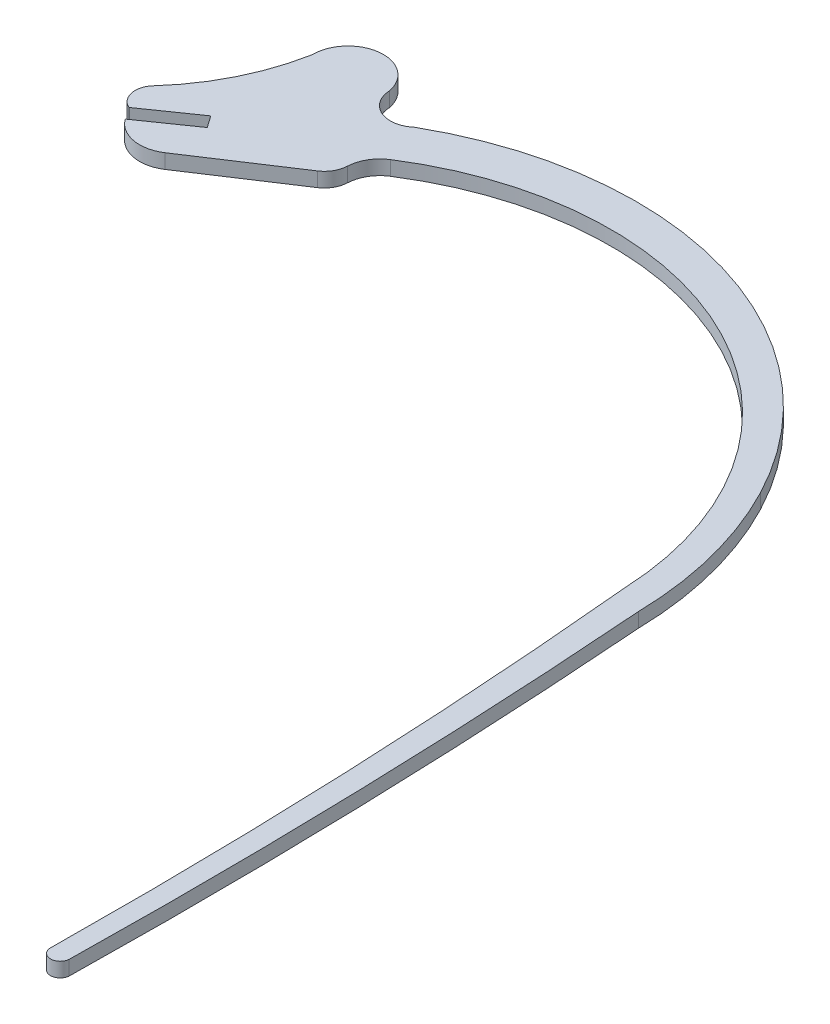
ISO-10303-21;
HEADER;
FILE_DESCRIPTION(('STEP AP214'),'2;1');
FILE_NAME('part.step','',(''),(''),'','','');
FILE_SCHEMA(('AUTOMOTIVE_DESIGN { 1 0 10303 214 1 1 1 1 }'));
ENDSEC;
DATA;
#1=APPLICATION_CONTEXT('core data for automotive mechanical design processes');
#2=APPLICATION_PROTOCOL_DEFINITION('international standard','automotive_design',2000,#1);
#3=PRODUCT_CONTEXT('',#1,'mechanical');
#4=PRODUCT('Part','Part','',(#3));
#5=PRODUCT_RELATED_PRODUCT_CATEGORY('part','',(#4));
#6=PRODUCT_DEFINITION_FORMATION('','',#4);
#7=PRODUCT_DEFINITION_CONTEXT('part definition',#1,'design');
#8=PRODUCT_DEFINITION('design','',#6,#7);
#9=PRODUCT_DEFINITION_SHAPE('','',#8);
#10=(LENGTH_UNIT() NAMED_UNIT(*) SI_UNIT(.MILLI.,.METRE.));
#11=(NAMED_UNIT(*) PLANE_ANGLE_UNIT() SI_UNIT($,.RADIAN.));
#12=(NAMED_UNIT(*) SI_UNIT($,.STERADIAN.) SOLID_ANGLE_UNIT());
#13=UNCERTAINTY_MEASURE_WITH_UNIT(LENGTH_MEASURE(1.E-05),#10,'distance_accuracy_value','');
#14=(GEOMETRIC_REPRESENTATION_CONTEXT(3) GLOBAL_UNCERTAINTY_ASSIGNED_CONTEXT((#13)) GLOBAL_UNIT_ASSIGNED_CONTEXT((#10,
#11,#12)) REPRESENTATION_CONTEXT('',''));
#15=CARTESIAN_POINT('',(0.,0.,0.));
#16=DIRECTION('',(0.,0.,1.));
#17=DIRECTION('',(1.,0.,0.));
#18=AXIS2_PLACEMENT_3D('',#15,#16,#17);
#19=CARTESIAN_POINT('',(-41890.0776006969,3.,-18429.1678708111));
#20=DIRECTION('',(0.,-1.,0.));
#21=DIRECTION('',(0.,0.,-1.));
#22=AXIS2_PLACEMENT_3D('',#19,#20,#21);
#23=CYLINDRICAL_SURFACE('',#22,7.45792893253138);
#24=CARTESIAN_POINT('',(-41890.0776006969,0.,-18429.1678708111));
#25=DIRECTION('',(0.,1.,0.));
#26=DIRECTION('',(0.,0.,1.));
#27=AXIS2_PLACEMENT_3D('',#24,#25,#26);
#28=CIRCLE('',#27,7.45792893253138);
#29=CARTESIAN_POINT('',(-41896.148437,0.,-18424.835937));
#30=VERTEX_POINT('',#29);
#31=CARTESIAN_POINT('',(-41885.984375,0.,-18422.933594));
#32=VERTEX_POINT('',#31);
#33=EDGE_CURVE('E185',#30,#32,#28,.T.);
#34=ORIENTED_EDGE('',*,*,#33,.T.);
#35=DIRECTION('',(0.,-1.,0.));
#36=VECTOR('',#35,1.);
#37=CARTESIAN_POINT('',(-41885.984375,3.,-18422.933594));
#38=LINE('',#37,#36);
#39=CARTESIAN_POINT('',(-41885.984375,3.,-18422.933594));
#40=VERTEX_POINT('',#39);
#41=EDGE_CURVE('E11',#40,#32,#38,.T.);
#42=ORIENTED_EDGE('',*,*,#41,.F.);
#43=CARTESIAN_POINT('',(-41890.0776006969,3.,-18429.1678708111));
#44=DIRECTION('',(0.,1.,0.));
#45=DIRECTION('',(0.,0.,1.));
#46=AXIS2_PLACEMENT_3D('',#43,#44,#45);
#47=CIRCLE('',#46,7.45792893253138);
#48=CARTESIAN_POINT('',(-41896.148437,3.,-18424.835937));
#49=VERTEX_POINT('',#48);
#50=EDGE_CURVE('E217',#49,#40,#47,.T.);
#51=ORIENTED_EDGE('',*,*,#50,.F.);
#52=DIRECTION('',(0.,-1.,0.));
#53=VECTOR('',#52,1.);
#54=CARTESIAN_POINT('',(-41896.148437,3.,-18424.835937));
#55=LINE('',#54,#53);
#56=EDGE_CURVE('E181',#49,#30,#55,.T.);
#57=ORIENTED_EDGE('',*,*,#56,.T.);
#58=EDGE_LOOP('',(#34,#42,#51,#57));
#59=FACE_BOUND('',#58,.T.);
#60=ADVANCED_FACE('F35',(#59),#23,.T.);
#61=CARTESIAN_POINT('',(-41866.9795919999,3.,-18435.427652));
#62=DIRECTION('',(-0.549337573256336,0.,-0.835600520948162));
#63=DIRECTION('',(-0.835600520948162,0.,0.549337573256336));
#64=AXIS2_PLACEMENT_3D('',#61,#62,#63);
#65=PLANE('',#64);
#66=DIRECTION('',(0.835600520948162,0.,-0.549337573256336));
#67=VECTOR('',#66,1.);
#68=CARTESIAN_POINT('',(-41866.9795919999,0.,-18435.427652));
#69=LINE('',#68,#67);
#70=CARTESIAN_POINT('',(-41866.979592,0.,-18435.427652));
#71=VERTEX_POINT('',#70);
#72=EDGE_CURVE('E188',#32,#71,#69,.T.);
#73=ORIENTED_EDGE('',*,*,#72,.T.);
#74=DIRECTION('',(0.,-1.,0.));
#75=VECTOR('',#74,1.);
#76=CARTESIAN_POINT('',(-41866.979592,3.,-18435.427652));
#77=LINE('',#76,#75);
#78=CARTESIAN_POINT('',(-41866.979592,3.,-18435.427652));
#79=VERTEX_POINT('',#78);
#80=EDGE_CURVE('E43',#79,#71,#77,.T.);
#81=ORIENTED_EDGE('',*,*,#80,.F.);
#82=DIRECTION('',(0.835600520948162,0.,-0.549337573256336));
#83=VECTOR('',#82,1.);
#84=CARTESIAN_POINT('',(-41866.9795919999,3.,-18435.427652));
#85=LINE('',#84,#83);
#86=EDGE_CURVE('E121',#40,#79,#85,.T.);
#87=ORIENTED_EDGE('',*,*,#86,.F.);
#88=ORIENTED_EDGE('',*,*,#41,.T.);
#89=EDGE_LOOP('',(#73,#81,#87,#88));
#90=FACE_BOUND('',#89,.T.);
#91=ADVANCED_FACE('F320',(#90),#65,.F.);
#92=CARTESIAN_POINT('',(-41869.7257293976,3.,-18439.6069290477));
#93=DIRECTION('',(0.,-1.,0.));
#94=DIRECTION('',(0.,0.,-1.));
#95=AXIS2_PLACEMENT_3D('',#92,#93,#94);
#96=CYLINDRICAL_SURFACE('',#95,5.00076266665453);
#97=CARTESIAN_POINT('',(-41869.7257293976,0.,-18439.6069290477));
#98=DIRECTION('',(0.,1.,0.));
#99=DIRECTION('',(0.,0.,1.));
#100=AXIS2_PLACEMENT_3D('',#97,#98,#99);
#101=CIRCLE('',#100,5.00076266665453);
#102=CARTESIAN_POINT('',(-41864.730505,0.,-18439.371641));
#103=VERTEX_POINT('',#102);
#104=EDGE_CURVE('E190',#71,#103,#101,.T.);
#105=ORIENTED_EDGE('',*,*,#104,.T.);
#106=DIRECTION('',(0.,-1.,0.));
#107=VECTOR('',#106,1.);
#108=CARTESIAN_POINT('',(-41864.730505,3.,-18439.371641));
#109=LINE('',#108,#107);
#110=CARTESIAN_POINT('',(-41864.730505,3.,-18439.371641));
#111=VERTEX_POINT('',#110);
#112=EDGE_CURVE('E251',#111,#103,#109,.T.);
#113=ORIENTED_EDGE('',*,*,#112,.F.);
#114=CARTESIAN_POINT('',(-41869.7257293976,3.,-18439.6069290477));
#115=DIRECTION('',(0.,1.,0.));
#116=DIRECTION('',(0.,0.,1.));
#117=AXIS2_PLACEMENT_3D('',#114,#115,#116);
#118=CIRCLE('',#117,5.00076266665453);
#119=EDGE_CURVE('E259',#79,#111,#118,.T.);
#120=ORIENTED_EDGE('',*,*,#119,.F.);
#121=ORIENTED_EDGE('',*,*,#80,.T.);
#122=EDGE_LOOP('',(#105,#113,#120,#121));
#123=FACE_BOUND('',#122,.T.);
#124=ADVANCED_FACE('F257',(#123),#96,.T.);
#125=CARTESIAN_POINT('',(-41857.6633660481,3.,-18439.0441717351));
#126=DIRECTION('',(0.,-1.,0.));
#127=DIRECTION('',(0.,0.,-1.));
#128=AXIS2_PLACEMENT_3D('',#125,#126,#127);
#129=CYLINDRICAL_SURFACE('',#128,7.07472183800304);
#130=CARTESIAN_POINT('',(-41857.6633660481,0.,-18439.0441717351));
#131=DIRECTION('',(0.,-1.,0.));
#132=DIRECTION('',(0.,0.,1.));
#133=AXIS2_PLACEMENT_3D('',#130,#131,#132);
#134=CIRCLE('',#133,7.07472183800304);
#135=CARTESIAN_POINT('',(-41861.4689960001,0.,-18445.008136));
#136=VERTEX_POINT('',#135);
#137=EDGE_CURVE('E192',#103,#136,#134,.T.);
#138=ORIENTED_EDGE('',*,*,#137,.T.);
#139=DIRECTION('',(0.,-1.,0.));
#140=VECTOR('',#139,1.);
#141=CARTESIAN_POINT('',(-41861.4689960001,3.,-18445.008136));
#142=LINE('',#141,#140);
#143=CARTESIAN_POINT('',(-41861.4689960001,3.,-18445.008136));
#144=VERTEX_POINT('',#143);
#145=EDGE_CURVE('E248',#144,#136,#142,.T.);
#146=ORIENTED_EDGE('',*,*,#145,.F.);
#147=CARTESIAN_POINT('',(-41857.6633660481,3.,-18439.0441717351));
#148=DIRECTION('',(0.,-1.,0.));
#149=DIRECTION('',(0.,0.,1.));
#150=AXIS2_PLACEMENT_3D('',#147,#148,#149);
#151=CIRCLE('',#150,7.07472183800304);
#152=EDGE_CURVE('E277',#111,#144,#151,.T.);
#153=ORIENTED_EDGE('',*,*,#152,.F.);
#154=ORIENTED_EDGE('',*,*,#112,.T.);
#155=EDGE_LOOP('',(#138,#146,#153,#154));
#156=FACE_BOUND('',#155,.T.);
#157=ADVANCED_FACE('F268',(#156),#129,.F.);
#158=CARTESIAN_POINT('',(-41826.1250165417,3.,-18389.6015705834));
#159=DIRECTION('',(0.,-1.,0.));
#160=DIRECTION('',(0.,0.,-1.));
#161=AXIS2_PLACEMENT_3D('',#158,#159,#160);
#162=CYLINDRICAL_SURFACE('',#161,65.719741137802);
#163=CARTESIAN_POINT('',(-41826.1250165417,0.,-18389.6015705834));
#164=DIRECTION('',(0.,-1.,0.));
#165=DIRECTION('',(0.,0.,1.));
#166=AXIS2_PLACEMENT_3D('',#163,#164,#165);
#167=CIRCLE('',#166,65.719741137802);
#168=CARTESIAN_POINT('',(-41760.4738210001,0.,-18392.6023870008));
#169=VERTEX_POINT('',#168);
#170=EDGE_CURVE('E194',#136,#169,#167,.T.);
#171=ORIENTED_EDGE('',*,*,#170,.T.);
#172=DIRECTION('',(0.,-1.,0.));
#173=VECTOR('',#172,1.);
#174=CARTESIAN_POINT('',(-41760.4738210001,3.,-18392.6023870008));
#175=LINE('',#174,#173);
#176=CARTESIAN_POINT('',(-41760.4738210001,3.,-18392.6023870008));
#177=VERTEX_POINT('',#176);
#178=EDGE_CURVE('E245',#177,#169,#175,.T.);
#179=ORIENTED_EDGE('',*,*,#178,.F.);
#180=CARTESIAN_POINT('',(-41826.1250165417,3.,-18389.6015705834));
#181=DIRECTION('',(0.,-1.,0.));
#182=DIRECTION('',(0.,0.,1.));
#183=AXIS2_PLACEMENT_3D('',#180,#181,#182);
#184=CIRCLE('',#183,65.719741137802);
#185=EDGE_CURVE('E274',#144,#177,#184,.T.);
#186=ORIENTED_EDGE('',*,*,#185,.F.);
#187=ORIENTED_EDGE('',*,*,#145,.T.);
#188=EDGE_LOOP('',(#171,#179,#186,#187));
#189=FACE_BOUND('',#188,.T.);
#190=ADVANCED_FACE('F272',(#189),#162,.F.);
#191=CARTESIAN_POINT('',(-42916.2538828003,3.,-18282.8705311043));
#192=DIRECTION('',(0.,-1.,0.));
#193=DIRECTION('',(0.,0.,-1.));
#194=AXIS2_PLACEMENT_3D('',#191,#192,#193);
#195=CYLINDRICAL_SURFACE('',#194,1160.977446574);
#196=CARTESIAN_POINT('',(-42916.2538828003,0.,-18282.8705311043));
#197=DIRECTION('',(0.,-1.,0.));
#198=DIRECTION('',(0.,0.,1.));
#199=AXIS2_PLACEMENT_3D('',#196,#197,#198);
#200=CIRCLE('',#199,1160.977446574);
#201=CARTESIAN_POINT('',(-41755.363965,0.,-18268.614648));
#202=VERTEX_POINT('',#201);
#203=EDGE_CURVE('E196',#169,#202,#200,.T.);
#204=ORIENTED_EDGE('',*,*,#203,.T.);
#205=DIRECTION('',(0.,-1.,0.));
#206=VECTOR('',#205,1.);
#207=CARTESIAN_POINT('',(-41755.363965,3.,-18268.614648));
#208=LINE('',#207,#206);
#209=CARTESIAN_POINT('',(-41755.363965,3.,-18268.614648));
#210=VERTEX_POINT('',#209);
#211=EDGE_CURVE('E242',#210,#202,#208,.T.);
#212=ORIENTED_EDGE('',*,*,#211,.F.);
#213=CARTESIAN_POINT('',(-42916.2538828003,3.,-18282.8705311043));
#214=DIRECTION('',(0.,-1.,0.));
#215=DIRECTION('',(0.,0.,1.));
#216=AXIS2_PLACEMENT_3D('',#213,#214,#215);
#217=CIRCLE('',#216,1160.977446574);
#218=EDGE_CURVE('E276',#177,#210,#217,.T.);
#219=ORIENTED_EDGE('',*,*,#218,.F.);
#220=ORIENTED_EDGE('',*,*,#178,.T.);
#221=EDGE_LOOP('',(#204,#212,#219,#220));
#222=FACE_BOUND('',#221,.T.);
#223=ADVANCED_FACE('F333',(#222),#195,.F.);
#224=CARTESIAN_POINT('',(-41753.3663240891,3.,-18268.5898071902));
#225=DIRECTION('',(0.,-1.,0.));
#226=DIRECTION('',(0.,0.,-1.));
#227=AXIS2_PLACEMENT_3D('',#224,#225,#226);
#228=CYLINDRICAL_SURFACE('',#227,1.99779535363044);
#229=CARTESIAN_POINT('',(-41753.3663240891,0.,-18268.5898071902));
#230=DIRECTION('',(0.,1.,0.));
#231=DIRECTION('',(0.,0.,1.));
#232=AXIS2_PLACEMENT_3D('',#229,#230,#231);
#233=CIRCLE('',#232,1.99779535363044);
#234=CARTESIAN_POINT('',(-41751.373825,0.,-18268.444433));
#235=VERTEX_POINT('',#234);
#236=EDGE_CURVE('E198',#202,#235,#233,.T.);
#237=ORIENTED_EDGE('',*,*,#236,.T.);
#238=DIRECTION('',(0.,-1.,0.));
#239=VECTOR('',#238,1.);
#240=CARTESIAN_POINT('',(-41751.373825,3.,-18268.444433));
#241=LINE('',#240,#239);
#242=CARTESIAN_POINT('',(-41751.373825,3.,-18268.444433));
#243=VERTEX_POINT('',#242);
#244=EDGE_CURVE('E239',#243,#235,#241,.T.);
#245=ORIENTED_EDGE('',*,*,#244,.F.);
#246=CARTESIAN_POINT('',(-41753.3663240891,3.,-18268.5898071902));
#247=DIRECTION('',(0.,1.,0.));
#248=DIRECTION('',(0.,0.,1.));
#249=AXIS2_PLACEMENT_3D('',#246,#247,#248);
#250=CIRCLE('',#249,1.99779535363044);
#251=EDGE_CURVE('E279',#210,#243,#250,.T.);
#252=ORIENTED_EDGE('',*,*,#251,.F.);
#253=ORIENTED_EDGE('',*,*,#211,.T.);
#254=EDGE_LOOP('',(#237,#245,#252,#253));
#255=FACE_BOUND('',#254,.T.);
#256=ADVANCED_FACE('F336',(#255),#228,.T.);
#257=CARTESIAN_POINT('',(-43051.2068226224,3.,-18292.3207608733));
#258=DIRECTION('',(0.,-1.,0.));
#259=DIRECTION('',(0.,0.,-1.));
#260=AXIS2_PLACEMENT_3D('',#257,#258,#259);
#261=CYLINDRICAL_SURFACE('',#260,1300.0522684649);
#262=CARTESIAN_POINT('',(-43051.2068226224,0.,-18292.3207608733));
#263=DIRECTION('',(0.,1.,0.));
#264=DIRECTION('',(0.,0.,1.));
#265=AXIS2_PLACEMENT_3D('',#262,#263,#264);
#266=CIRCLE('',#265,1300.0522684649);
#267=CARTESIAN_POINT('',(-41754.803806,0.,-18389.6609850006));
#268=VERTEX_POINT('',#267);
#269=EDGE_CURVE('E200',#235,#268,#266,.T.);
#270=ORIENTED_EDGE('',*,*,#269,.T.);
#271=DIRECTION('',(0.,-1.,0.));
#272=VECTOR('',#271,1.);
#273=CARTESIAN_POINT('',(-41754.803806,3.,-18389.6609850006));
#274=LINE('',#273,#272);
#275=CARTESIAN_POINT('',(-41754.803806,3.,-18389.6609850006));
#276=VERTEX_POINT('',#275);
#277=EDGE_CURVE('E236',#276,#268,#274,.T.);
#278=ORIENTED_EDGE('',*,*,#277,.F.);
#279=CARTESIAN_POINT('',(-43051.2068226224,3.,-18292.3207608733));
#280=DIRECTION('',(0.,1.,0.));
#281=DIRECTION('',(0.,0.,1.));
#282=AXIS2_PLACEMENT_3D('',#279,#280,#281);
#283=CIRCLE('',#282,1300.0522684649);
#284=EDGE_CURVE('E285',#243,#276,#283,.T.);
#285=ORIENTED_EDGE('',*,*,#284,.F.);
#286=ORIENTED_EDGE('',*,*,#244,.T.);
#287=EDGE_LOOP('',(#270,#278,#285,#286));
#288=FACE_BOUND('',#287,.T.);
#289=ADVANCED_FACE('F340',(#288),#261,.T.);
#290=CARTESIAN_POINT('',(-41831.1839195737,3.,-18388.2297942268));
#291=DIRECTION('',(0.,-1.,0.));
#292=DIRECTION('',(0.,0.,-1.));
#293=AXIS2_PLACEMENT_3D('',#290,#291,#292);
#294=CYLINDRICAL_SURFACE('',#293,76.3935210377964);
#295=CARTESIAN_POINT('',(-41831.1839195737,0.,-18388.2297942268));
#296=DIRECTION('',(0.,1.,0.));
#297=DIRECTION('',(0.,0.,1.));
#298=AXIS2_PLACEMENT_3D('',#295,#296,#297);
#299=CIRCLE('',#298,76.3935210377964);
#300=CARTESIAN_POINT('',(-41763.425823,0.,-18423.511665));
#301=VERTEX_POINT('',#300);
#302=EDGE_CURVE('E202',#268,#301,#299,.T.);
#303=ORIENTED_EDGE('',*,*,#302,.T.);
#304=DIRECTION('',(0.,-1.,0.));
#305=VECTOR('',#304,1.);
#306=CARTESIAN_POINT('',(-41763.425823,3.,-18423.511665));
#307=LINE('',#306,#305);
#308=CARTESIAN_POINT('',(-41763.425823,3.,-18423.511665));
#309=VERTEX_POINT('',#308);
#310=EDGE_CURVE('E233',#309,#301,#307,.T.);
#311=ORIENTED_EDGE('',*,*,#310,.F.);
#312=CARTESIAN_POINT('',(-41831.1839195737,3.,-18388.2297942268));
#313=DIRECTION('',(0.,1.,0.));
#314=DIRECTION('',(0.,0.,1.));
#315=AXIS2_PLACEMENT_3D('',#312,#313,#314);
#316=CIRCLE('',#315,76.3935210377964);
#317=EDGE_CURVE('E287',#276,#309,#316,.T.);
#318=ORIENTED_EDGE('',*,*,#317,.F.);
#319=ORIENTED_EDGE('',*,*,#277,.T.);
#320=EDGE_LOOP('',(#303,#311,#318,#319));
#321=FACE_BOUND('',#320,.T.);
#322=ADVANCED_FACE('F344',(#321),#294,.T.);
#323=CARTESIAN_POINT('',(-41828.4170991657,3.,-18389.6696663583));
#324=DIRECTION('',(0.,-1.,0.));
#325=DIRECTION('',(0.,0.,-1.));
#326=AXIS2_PLACEMENT_3D('',#323,#324,#325);
#327=CYLINDRICAL_SURFACE('',#326,73.2744624661577);
#328=CARTESIAN_POINT('',(-41828.4170991657,0.,-18389.6696663583));
#329=DIRECTION('',(0.,1.,0.));
#330=DIRECTION('',(0.,0.,1.));
#331=AXIS2_PLACEMENT_3D('',#328,#329,#330);
#332=CIRCLE('',#331,73.2744624661577);
#333=CARTESIAN_POINT('',(-41864.763185,0.,-18453.294417));
#334=VERTEX_POINT('',#333);
#335=EDGE_CURVE('E204',#301,#334,#332,.T.);
#336=ORIENTED_EDGE('',*,*,#335,.T.);
#337=DIRECTION('',(0.,-1.,0.));
#338=VECTOR('',#337,1.);
#339=CARTESIAN_POINT('',(-41864.763185,3.,-18453.294417));
#340=LINE('',#339,#338);
#341=CARTESIAN_POINT('',(-41864.763185,3.,-18453.294417));
#342=VERTEX_POINT('',#341);
#343=EDGE_CURVE('E230',#342,#334,#340,.T.);
#344=ORIENTED_EDGE('',*,*,#343,.F.);
#345=CARTESIAN_POINT('',(-41828.4170991657,3.,-18389.6696663583));
#346=DIRECTION('',(0.,1.,0.));
#347=DIRECTION('',(0.,0.,1.));
#348=AXIS2_PLACEMENT_3D('',#345,#346,#347);
#349=CIRCLE('',#348,73.2744624661577);
#350=EDGE_CURVE('E289',#309,#342,#349,.T.);
#351=ORIENTED_EDGE('',*,*,#350,.F.);
#352=ORIENTED_EDGE('',*,*,#310,.T.);
#353=EDGE_LOOP('',(#336,#344,#351,#352));
#354=FACE_BOUND('',#353,.T.);
#355=ADVANCED_FACE('F348',(#354),#327,.T.);
#356=CARTESIAN_POINT('',(-41868.3822196625,3.,-18457.4235716495));
#357=DIRECTION('',(0.,-1.,0.));
#358=DIRECTION('',(0.,0.,-1.));
#359=AXIS2_PLACEMENT_3D('',#356,#357,#358);
#360=CYLINDRICAL_SURFACE('',#359,5.49065843119995);
#361=CARTESIAN_POINT('',(-41868.3822196625,0.,-18457.4235716495));
#362=DIRECTION('',(0.,-1.,0.));
#363=DIRECTION('',(0.,0.,1.));
#364=AXIS2_PLACEMENT_3D('',#361,#362,#363);
#365=CIRCLE('',#364,5.49065843119995);
#366=CARTESIAN_POINT('',(-41873.8696560001,0.,-18457.235496));
#367=VERTEX_POINT('',#366);
#368=EDGE_CURVE('E206',#334,#367,#365,.T.);
#369=ORIENTED_EDGE('',*,*,#368,.T.);
#370=DIRECTION('',(0.,-1.,0.));
#371=VECTOR('',#370,1.);
#372=CARTESIAN_POINT('',(-41873.8696560001,3.,-18457.235496));
#373=LINE('',#372,#371);
#374=CARTESIAN_POINT('',(-41873.8696560001,3.,-18457.235496));
#375=VERTEX_POINT('',#374);
#376=EDGE_CURVE('E227',#375,#367,#373,.T.);
#377=ORIENTED_EDGE('',*,*,#376,.F.);
#378=CARTESIAN_POINT('',(-41868.3822196625,3.,-18457.4235716495));
#379=DIRECTION('',(0.,-1.,0.));
#380=DIRECTION('',(0.,0.,1.));
#381=AXIS2_PLACEMENT_3D('',#378,#379,#380);
#382=CIRCLE('',#381,5.49065843119995);
#383=EDGE_CURVE('E291',#342,#375,#382,.T.);
#384=ORIENTED_EDGE('',*,*,#383,.F.);
#385=ORIENTED_EDGE('',*,*,#343,.T.);
#386=EDGE_LOOP('',(#369,#377,#384,#385));
#387=FACE_BOUND('',#386,.T.);
#388=ADVANCED_FACE('F352',(#387),#360,.F.);
#389=CARTESIAN_POINT('',(-41881.0396504604,3.,-18455.818296741));
#390=DIRECTION('',(0.,-1.,0.));
#391=DIRECTION('',(0.,0.,-1.));
#392=AXIS2_PLACEMENT_3D('',#389,#390,#391);
#393=CYLINDRICAL_SURFACE('',#392,7.30871221906831);
#394=CARTESIAN_POINT('',(-41881.0396504604,0.,-18455.818296741));
#395=DIRECTION('',(0.,1.,0.));
#396=DIRECTION('',(0.,0.,1.));
#397=AXIS2_PLACEMENT_3D('',#394,#395,#396);
#398=CIRCLE('',#397,7.30871221906831);
#399=CARTESIAN_POINT('',(-41888.347465,0.,-18455.70375));
#400=VERTEX_POINT('',#399);
#401=EDGE_CURVE('E208',#367,#400,#398,.T.);
#402=ORIENTED_EDGE('',*,*,#401,.T.);
#403=DIRECTION('',(0.,-1.,0.));
#404=VECTOR('',#403,1.);
#405=CARTESIAN_POINT('',(-41888.347465,3.,-18455.70375));
#406=LINE('',#405,#404);
#407=CARTESIAN_POINT('',(-41888.347465,3.,-18455.70375));
#408=VERTEX_POINT('',#407);
#409=EDGE_CURVE('E224',#408,#400,#406,.T.);
#410=ORIENTED_EDGE('',*,*,#409,.F.);
#411=CARTESIAN_POINT('',(-41881.0396504604,3.,-18455.818296741));
#412=DIRECTION('',(0.,1.,0.));
#413=DIRECTION('',(0.,0.,1.));
#414=AXIS2_PLACEMENT_3D('',#411,#412,#413);
#415=CIRCLE('',#414,7.30871221906831);
#416=EDGE_CURVE('E293',#375,#408,#415,.T.);
#417=ORIENTED_EDGE('',*,*,#416,.F.);
#418=ORIENTED_EDGE('',*,*,#376,.T.);
#419=EDGE_LOOP('',(#402,#410,#417,#418));
#420=FACE_BOUND('',#419,.T.);
#421=ADVANCED_FACE('F356',(#420),#393,.T.);
#422=CARTESIAN_POINT('',(-41932.8469967799,3.,-18463.983751653));
#423=DIRECTION('',(0.,-1.,0.));
#424=DIRECTION('',(0.,0.,-1.));
#425=AXIS2_PLACEMENT_3D('',#422,#423,#424);
#426=CYLINDRICAL_SURFACE('',#425,45.2633047401953);
#427=CARTESIAN_POINT('',(-41932.8469967799,0.,-18463.983751653));
#428=DIRECTION('',(0.,-1.,0.));
#429=DIRECTION('',(0.,0.,1.));
#430=AXIS2_PLACEMENT_3D('',#427,#428,#429);
#431=CIRCLE('',#430,45.2633047401953);
#432=CARTESIAN_POINT('',(-41899.317041,0.,-18433.578015));
#433=VERTEX_POINT('',#432);
#434=EDGE_CURVE('E210',#400,#433,#431,.T.);
#435=ORIENTED_EDGE('',*,*,#434,.T.);
#436=DIRECTION('',(0.,-1.,0.));
#437=VECTOR('',#436,1.);
#438=CARTESIAN_POINT('',(-41899.317041,3.,-18433.578015));
#439=LINE('',#438,#437);
#440=CARTESIAN_POINT('',(-41899.317041,3.,-18433.578015));
#441=VERTEX_POINT('',#440);
#442=EDGE_CURVE('E221',#441,#433,#439,.T.);
#443=ORIENTED_EDGE('',*,*,#442,.F.);
#444=CARTESIAN_POINT('',(-41932.8469967799,3.,-18463.983751653));
#445=DIRECTION('',(0.,-1.,0.));
#446=DIRECTION('',(0.,0.,1.));
#447=AXIS2_PLACEMENT_3D('',#444,#445,#446);
#448=CIRCLE('',#447,45.2633047401953);
#449=EDGE_CURVE('E295',#408,#441,#448,.T.);
#450=ORIENTED_EDGE('',*,*,#449,.F.);
#451=ORIENTED_EDGE('',*,*,#409,.T.);
#452=EDGE_LOOP('',(#435,#443,#450,#451));
#453=FACE_BOUND('',#452,.T.);
#454=ADVANCED_FACE('F301',(#453),#426,.F.);
#455=CARTESIAN_POINT('',(-41896.2228812426,3.,-18430.9853481864));
#456=DIRECTION('',(0.,-1.,0.));
#457=DIRECTION('',(0.,0.,-1.));
#458=AXIS2_PLACEMENT_3D('',#455,#456,#457);
#459=CYLINDRICAL_SURFACE('',#458,4.03679895599772);
#460=CARTESIAN_POINT('',(-41896.2228812426,0.,-18430.9853481864));
#461=DIRECTION('',(0.,1.,0.));
#462=DIRECTION('',(0.,0.,1.));
#463=AXIS2_PLACEMENT_3D('',#460,#461,#462);
#464=CIRCLE('',#463,4.03679895599772);
#465=CARTESIAN_POINT('',(-41897.863281,0.,-18427.296875));
#466=VERTEX_POINT('',#465);
#467=EDGE_CURVE('E212',#433,#466,#464,.T.);
#468=ORIENTED_EDGE('',*,*,#467,.T.);
#469=DIRECTION('',(0.,-1.,0.));
#470=VECTOR('',#469,1.);
#471=CARTESIAN_POINT('',(-41897.863281,3.,-18427.296875));
#472=LINE('',#471,#470);
#473=CARTESIAN_POINT('',(-41897.863281,3.,-18427.296875));
#474=VERTEX_POINT('',#473);
#475=EDGE_CURVE('E176',#474,#466,#472,.T.);
#476=ORIENTED_EDGE('',*,*,#475,.F.);
#477=CARTESIAN_POINT('',(-41896.2228812426,3.,-18430.9853481864));
#478=DIRECTION('',(0.,1.,0.));
#479=DIRECTION('',(0.,0.,1.));
#480=AXIS2_PLACEMENT_3D('',#477,#478,#479);
#481=CIRCLE('',#480,4.03679895599772);
#482=EDGE_CURVE('E167',#441,#474,#481,.T.);
#483=ORIENTED_EDGE('',*,*,#482,.F.);
#484=ORIENTED_EDGE('',*,*,#442,.T.);
#485=EDGE_LOOP('',(#468,#476,#483,#484));
#486=FACE_BOUND('',#485,.T.);
#487=ADVANCED_FACE('F305',(#486),#459,.T.);
#488=CARTESIAN_POINT('',(-41887.871094,3.,-18434.255859));
#489=DIRECTION('',(-0.571501467385021,0.,-0.820601043611795));
#490=DIRECTION('',(-0.820601043611795,0.,0.571501467385022));
#491=AXIS2_PLACEMENT_3D('',#488,#489,#490);
#492=PLANE('',#491);
#493=DIRECTION('',(0.820601043611795,0.,-0.571501467385022));
#494=VECTOR('',#493,1.);
#495=CARTESIAN_POINT('',(-41887.871094,0.,-18434.255859));
#496=LINE('',#495,#494);
#497=CARTESIAN_POINT('',(-41887.871094,0.,-18434.255859));
#498=VERTEX_POINT('',#497);
#499=EDGE_CURVE('E175',#466,#498,#496,.T.);
#500=ORIENTED_EDGE('',*,*,#499,.T.);
#501=DIRECTION('',(0.,-1.,0.));
#502=VECTOR('',#501,1.);
#503=CARTESIAN_POINT('',(-41887.871094,3.,-18434.255859));
#504=LINE('',#503,#502);
#505=CARTESIAN_POINT('',(-41887.871094,3.,-18434.255859));
#506=VERTEX_POINT('',#505);
#507=EDGE_CURVE('E172',#506,#498,#504,.T.);
#508=ORIENTED_EDGE('',*,*,#507,.F.);
#509=DIRECTION('',(0.820601043611795,0.,-0.571501467385022));
#510=VECTOR('',#509,1.);
#511=CARTESIAN_POINT('',(-41887.871094,3.,-18434.255859));
#512=LINE('',#511,#510);
#513=EDGE_CURVE('E161',#474,#506,#512,.T.);
#514=ORIENTED_EDGE('',*,*,#513,.F.);
#515=ORIENTED_EDGE('',*,*,#475,.T.);
#516=EDGE_LOOP('',(#500,#508,#514,#515));
#517=FACE_BOUND('',#516,.T.);
#518=ADVANCED_FACE('F173',(#517),#492,.F.);
#519=CARTESIAN_POINT('',(-41886.15625,3.,-18431.794922));
#520=DIRECTION('',(0.820453606533987,0.,-0.571713109457334));
#521=DIRECTION('',(-0.571713109457334,0.,-0.820453606533987));
#522=AXIS2_PLACEMENT_3D('',#519,#520,#521);
#523=PLANE('',#522);
#524=DIRECTION('',(0.571713109457334,0.,0.820453606533987));
#525=VECTOR('',#524,1.);
#526=CARTESIAN_POINT('',(-41886.15625,0.,-18431.794922));
#527=LINE('',#526,#525);
#528=CARTESIAN_POINT('',(-41886.15625,0.,-18431.794922));
#529=VERTEX_POINT('',#528);
#530=EDGE_CURVE('E107',#498,#529,#527,.T.);
#531=ORIENTED_EDGE('',*,*,#530,.T.);
#532=DIRECTION('',(0.,-1.,0.));
#533=VECTOR('',#532,1.);
#534=CARTESIAN_POINT('',(-41886.15625,3.,-18431.794922));
#535=LINE('',#534,#533);
#536=CARTESIAN_POINT('',(-41886.15625,3.,-18431.794922));
#537=VERTEX_POINT('',#536);
#538=EDGE_CURVE('E177',#537,#529,#535,.T.);
#539=ORIENTED_EDGE('',*,*,#538,.F.);
#540=DIRECTION('',(0.571713109457334,0.,0.820453606533987));
#541=VECTOR('',#540,1.);
#542=CARTESIAN_POINT('',(-41886.15625,3.,-18431.794922));
#543=LINE('',#542,#541);
#544=EDGE_CURVE('E165',#506,#537,#543,.T.);
#545=ORIENTED_EDGE('',*,*,#544,.F.);
#546=ORIENTED_EDGE('',*,*,#507,.T.);
#547=EDGE_LOOP('',(#531,#539,#545,#546));
#548=FACE_BOUND('',#547,.T.);
#549=ADVANCED_FACE('F179',(#548),#523,.F.);
#550=CARTESIAN_POINT('',(-41896.148437,3.,-18424.835937));
#551=DIRECTION('',(0.571501522685806,0.,0.820601005097974));
#552=DIRECTION('',(0.820601005097974,0.,-0.571501522685806));
#553=AXIS2_PLACEMENT_3D('',#550,#551,#552);
#554=PLANE('',#553);
#555=DIRECTION('',(-0.820601005097974,0.,0.571501522685806));
#556=VECTOR('',#555,1.);
#557=CARTESIAN_POINT('',(-41896.148437,0.,-18424.835937));
#558=LINE('',#557,#556);
#559=EDGE_CURVE('E113',#529,#30,#558,.T.);
#560=ORIENTED_EDGE('',*,*,#559,.T.);
#561=ORIENTED_EDGE('',*,*,#56,.F.);
#562=DIRECTION('',(-0.820601005097974,0.,0.571501522685806));
#563=VECTOR('',#562,1.);
#564=CARTESIAN_POINT('',(-41896.148437,3.,-18424.835937));
#565=LINE('',#564,#563);
#566=EDGE_CURVE('E51',#537,#49,#565,.T.);
#567=ORIENTED_EDGE('',*,*,#566,.F.);
#568=ORIENTED_EDGE('',*,*,#538,.T.);
#569=EDGE_LOOP('',(#560,#561,#567,#568));
#570=FACE_BOUND('',#569,.T.);
#571=ADVANCED_FACE('F309',(#570),#554,.F.);
#572=CARTESIAN_POINT('',(-41890.0776006969,3.,-18429.1678708111));
#573=DIRECTION('',(0.,1.,0.));
#574=DIRECTION('',(0.,0.,1.));
#575=AXIS2_PLACEMENT_3D('',#572,#573,#574);
#576=PLANE('',#575);
#577=ORIENTED_EDGE('',*,*,#50,.T.);
#578=ORIENTED_EDGE('',*,*,#86,.T.);
#579=ORIENTED_EDGE('',*,*,#119,.T.);
#580=ORIENTED_EDGE('',*,*,#152,.T.);
#581=ORIENTED_EDGE('',*,*,#185,.T.);
#582=ORIENTED_EDGE('',*,*,#218,.T.);
#583=ORIENTED_EDGE('',*,*,#251,.T.);
#584=ORIENTED_EDGE('',*,*,#284,.T.);
#585=ORIENTED_EDGE('',*,*,#317,.T.);
#586=ORIENTED_EDGE('',*,*,#350,.T.);
#587=ORIENTED_EDGE('',*,*,#383,.T.);
#588=ORIENTED_EDGE('',*,*,#416,.T.);
#589=ORIENTED_EDGE('',*,*,#449,.T.);
#590=ORIENTED_EDGE('',*,*,#482,.T.);
#591=ORIENTED_EDGE('',*,*,#513,.T.);
#592=ORIENTED_EDGE('',*,*,#544,.T.);
#593=ORIENTED_EDGE('',*,*,#566,.T.);
#594=EDGE_LOOP('',(#577,#578,#579,#580,#581,#582,#583,#584,#585,#586,#587,#588,#589,#590,#591,
#592,#593));
#595=FACE_BOUND('',#594,.T.);
#596=ADVANCED_FACE('F163',(#595),#576,.T.);
#597=CARTESIAN_POINT('',(-41890.0776006969,0.,-18429.1678708111));
#598=DIRECTION('',(0.,1.,0.));
#599=DIRECTION('',(0.,0.,1.));
#600=AXIS2_PLACEMENT_3D('',#597,#598,#599);
#601=PLANE('',#600);
#602=ORIENTED_EDGE('',*,*,#33,.F.);
#603=ORIENTED_EDGE('',*,*,#559,.F.);
#604=ORIENTED_EDGE('',*,*,#530,.F.);
#605=ORIENTED_EDGE('',*,*,#499,.F.);
#606=ORIENTED_EDGE('',*,*,#467,.F.);
#607=ORIENTED_EDGE('',*,*,#434,.F.);
#608=ORIENTED_EDGE('',*,*,#401,.F.);
#609=ORIENTED_EDGE('',*,*,#368,.F.);
#610=ORIENTED_EDGE('',*,*,#335,.F.);
#611=ORIENTED_EDGE('',*,*,#302,.F.);
#612=ORIENTED_EDGE('',*,*,#269,.F.);
#613=ORIENTED_EDGE('',*,*,#236,.F.);
#614=ORIENTED_EDGE('',*,*,#203,.F.);
#615=ORIENTED_EDGE('',*,*,#170,.F.);
#616=ORIENTED_EDGE('',*,*,#137,.F.);
#617=ORIENTED_EDGE('',*,*,#104,.F.);
#618=ORIENTED_EDGE('',*,*,#72,.F.);
#619=EDGE_LOOP('',(#602,#603,#604,#605,#606,#607,#608,#609,#610,#611,#612,#613,#614,#615,#616,
#617,#618));
#620=FACE_BOUND('',#619,.T.);
#621=ADVANCED_FACE('F263',(#620),#601,.F.);
#622=CLOSED_SHELL('',(#60,#91,#124,#157,#190,#223,#256,#289,#322,#355,#388,#421,#454,#487,#518,
#549,#571,#596,#621));
#623=MANIFOLD_SOLID_BREP('B2',#622);
#624=ADVANCED_BREP_SHAPE_REPRESENTATION('',(#18,#623),#14);
#625=SHAPE_DEFINITION_REPRESENTATION(#9,#624);
ENDSEC;
END-ISO-10303-21;
